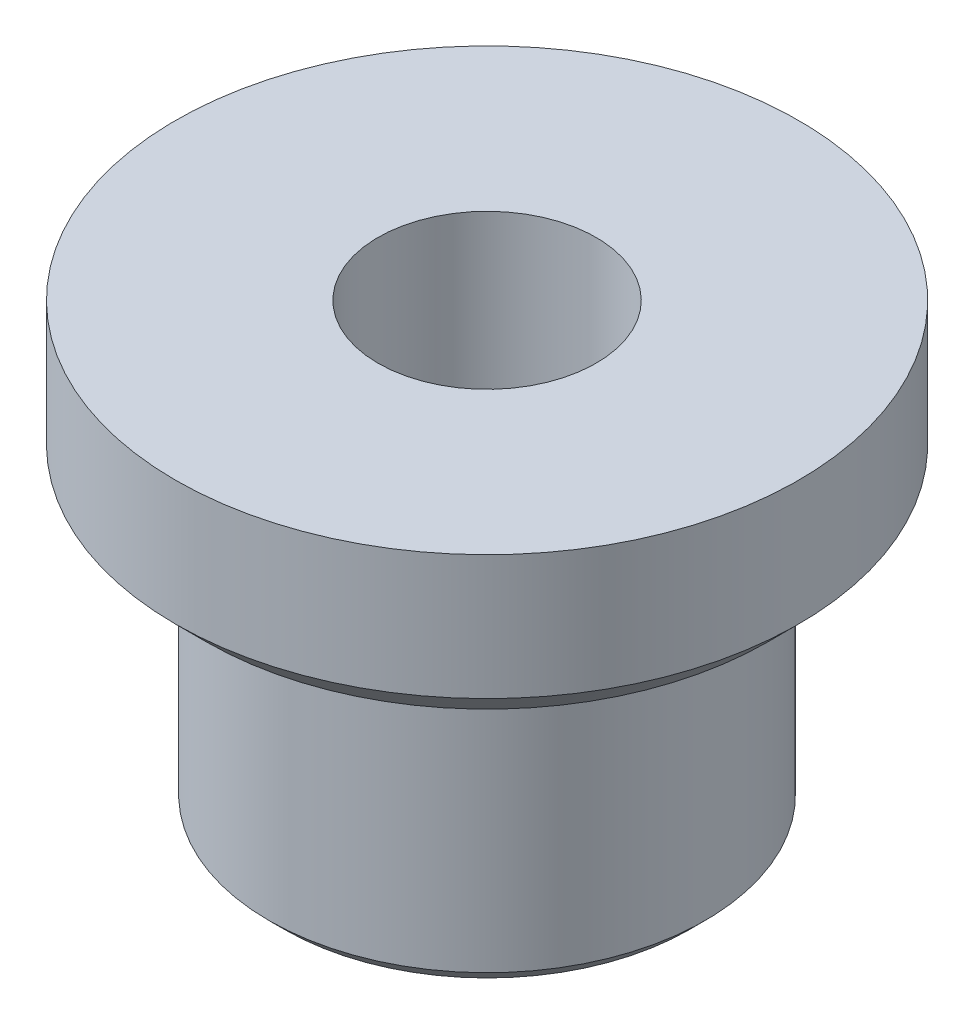
ISO-10303-21;
HEADER;
FILE_DESCRIPTION(('STEP AP214'),'2;1');
FILE_NAME('part.step','',(''),(''),'','','');
FILE_SCHEMA(('AUTOMOTIVE_DESIGN { 1 0 10303 214 1 1 1 1 }'));
ENDSEC;
DATA;
#1=APPLICATION_CONTEXT('core data for automotive mechanical design processes');
#2=APPLICATION_PROTOCOL_DEFINITION('international standard','automotive_design',2000,#1);
#3=PRODUCT_CONTEXT('',#1,'mechanical');
#4=PRODUCT('Part','Part','',(#3));
#5=PRODUCT_RELATED_PRODUCT_CATEGORY('part','',(#4));
#6=PRODUCT_DEFINITION_FORMATION('','',#4);
#7=PRODUCT_DEFINITION_CONTEXT('part definition',#1,'design');
#8=PRODUCT_DEFINITION('design','',#6,#7);
#9=PRODUCT_DEFINITION_SHAPE('','',#8);
#10=(LENGTH_UNIT() NAMED_UNIT(*) SI_UNIT(.MILLI.,.METRE.));
#11=(NAMED_UNIT(*) PLANE_ANGLE_UNIT() SI_UNIT($,.RADIAN.));
#12=(NAMED_UNIT(*) SI_UNIT($,.STERADIAN.) SOLID_ANGLE_UNIT());
#13=UNCERTAINTY_MEASURE_WITH_UNIT(LENGTH_MEASURE(1.E-05),#10,'distance_accuracy_value','');
#14=(GEOMETRIC_REPRESENTATION_CONTEXT(3) GLOBAL_UNCERTAINTY_ASSIGNED_CONTEXT((#13)) GLOBAL_UNIT_ASSIGNED_CONTEXT((#10,
#11,#12)) REPRESENTATION_CONTEXT('',''));
#15=CARTESIAN_POINT('',(0.,0.,0.));
#16=DIRECTION('',(0.,0.,1.));
#17=DIRECTION('',(1.,0.,0.));
#18=AXIS2_PLACEMENT_3D('',#15,#16,#17);
#19=CARTESIAN_POINT('',(0.,-5.,0.));
#20=DIRECTION('',(0.,1.,0.));
#21=DIRECTION('',(0.,0.,1.));
#22=AXIS2_PLACEMENT_3D('',#19,#20,#21);
#23=CYLINDRICAL_SURFACE('',#22,10.);
#24=CARTESIAN_POINT('',(0.,-4.00000000000001,0.));
#25=DIRECTION('',(0.,1.,0.));
#26=DIRECTION('',(0.,0.,1.));
#27=AXIS2_PLACEMENT_3D('',#24,#25,#26);
#28=CIRCLE('',#27,10.);
#29=CARTESIAN_POINT('',(0.,-4.00000000000001,10.));
#30=VERTEX_POINT('',#29);
#31=EDGE_CURVE('E51',#30,#30,#28,.T.);
#32=ORIENTED_EDGE('',*,*,#31,.T.);
#33=EDGE_LOOP('',(#32));
#34=FACE_BOUND('',#33,.T.);
#35=CARTESIAN_POINT('',(0.,0.,0.));
#36=DIRECTION('',(0.,1.,0.));
#37=DIRECTION('',(0.,0.,1.));
#38=AXIS2_PLACEMENT_3D('',#35,#36,#37);
#39=CIRCLE('',#38,10.);
#40=CARTESIAN_POINT('',(0.,0.,10.));
#41=VERTEX_POINT('',#40);
#42=EDGE_CURVE('E70',#41,#41,#39,.T.);
#43=ORIENTED_EDGE('',*,*,#42,.F.);
#44=EDGE_LOOP('',(#43));
#45=FACE_BOUND('',#44,.T.);
#46=ADVANCED_FACE('F43',(#34,#45),#23,.T.);
#47=CARTESIAN_POINT('',(0.,-5.,0.));
#48=DIRECTION('',(0.,1.,0.));
#49=DIRECTION('',(0.,0.,1.));
#50=AXIS2_PLACEMENT_3D('',#47,#48,#49);
#51=PLANE('',#50);
#52=CARTESIAN_POINT('',(0.,-5.,0.));
#53=DIRECTION('',(0.,1.,0.));
#54=DIRECTION('',(0.,0.,1.));
#55=AXIS2_PLACEMENT_3D('',#52,#53,#54);
#56=CIRCLE('',#55,9.);
#57=CARTESIAN_POINT('',(0.,-5.,9.));
#58=VERTEX_POINT('',#57);
#59=EDGE_CURVE('E11',#58,#58,#56,.F.);
#60=ORIENTED_EDGE('',*,*,#59,.T.);
#61=EDGE_LOOP('',(#60));
#62=FACE_BOUND('',#61,.T.);
#63=CARTESIAN_POINT('',(0.,-5.,0.));
#64=DIRECTION('',(0.,1.,0.));
#65=DIRECTION('',(0.,0.,1.));
#66=AXIS2_PLACEMENT_3D('',#63,#64,#65);
#67=CIRCLE('',#66,7.);
#68=CARTESIAN_POINT('',(0.,-5.,7.));
#69=VERTEX_POINT('',#68);
#70=EDGE_CURVE('E82',#69,#69,#67,.T.);
#71=ORIENTED_EDGE('',*,*,#70,.T.);
#72=EDGE_LOOP('',(#71));
#73=FACE_BOUND('',#72,.T.);
#74=ADVANCED_FACE('F92',(#62,#73),#51,.F.);
#75=CARTESIAN_POINT('',(0.,0.,0.));
#76=DIRECTION('',(0.,1.,0.));
#77=DIRECTION('',(0.,0.,1.));
#78=AXIS2_PLACEMENT_3D('',#75,#76,#77);
#79=PLANE('',#78);
#80=CARTESIAN_POINT('',(0.,0.,0.));
#81=DIRECTION('',(0.,1.,0.));
#82=DIRECTION('',(0.,0.,1.));
#83=AXIS2_PLACEMENT_3D('',#80,#81,#82);
#84=CIRCLE('',#83,3.5);
#85=CARTESIAN_POINT('',(0.,0.,3.5));
#86=VERTEX_POINT('',#85);
#87=EDGE_CURVE('E71',#86,#86,#84,.T.);
#88=ORIENTED_EDGE('',*,*,#87,.F.);
#89=EDGE_LOOP('',(#88));
#90=FACE_BOUND('',#89,.T.);
#91=ORIENTED_EDGE('',*,*,#42,.T.);
#92=EDGE_LOOP('',(#91));
#93=FACE_BOUND('',#92,.T.);
#94=ADVANCED_FACE('F97',(#90,#93),#79,.T.);
#95=CARTESIAN_POINT('',(0.,-14.24,0.));
#96=DIRECTION('',(0.,1.,0.));
#97=DIRECTION('',(0.,0.,1.));
#98=AXIS2_PLACEMENT_3D('',#95,#96,#97);
#99=CYLINDRICAL_SURFACE('',#98,7.);
#100=CARTESIAN_POINT('',(0.,-13.74,0.));
#101=DIRECTION('',(0.,1.,0.));
#102=DIRECTION('',(0.,0.,1.));
#103=AXIS2_PLACEMENT_3D('',#100,#101,#102);
#104=CIRCLE('',#103,7.);
#105=CARTESIAN_POINT('',(0.,-13.74,7.));
#106=VERTEX_POINT('',#105);
#107=EDGE_CURVE('E55',#106,#106,#104,.T.);
#108=ORIENTED_EDGE('',*,*,#107,.T.);
#109=EDGE_LOOP('',(#108));
#110=FACE_BOUND('',#109,.T.);
#111=ORIENTED_EDGE('',*,*,#70,.F.);
#112=EDGE_LOOP('',(#111));
#113=FACE_BOUND('',#112,.T.);
#114=ADVANCED_FACE('F94',(#110,#113),#99,.T.);
#115=CARTESIAN_POINT('',(0.,-14.24,0.));
#116=DIRECTION('',(0.,1.,0.));
#117=DIRECTION('',(0.,0.,1.));
#118=AXIS2_PLACEMENT_3D('',#115,#116,#117);
#119=PLANE('',#118);
#120=CARTESIAN_POINT('',(0.,-14.24,0.));
#121=DIRECTION('',(0.,1.,0.));
#122=DIRECTION('',(0.,0.,1.));
#123=AXIS2_PLACEMENT_3D('',#120,#121,#122);
#124=CIRCLE('',#123,5.7);
#125=CARTESIAN_POINT('',(0.,-14.24,5.7));
#126=VERTEX_POINT('',#125);
#127=EDGE_CURVE('E64',#126,#126,#124,.T.);
#128=ORIENTED_EDGE('',*,*,#127,.T.);
#129=EDGE_LOOP('',(#128));
#130=FACE_BOUND('',#129,.T.);
#131=CARTESIAN_POINT('',(0.,-14.24,0.));
#132=DIRECTION('',(0.,1.,0.));
#133=DIRECTION('',(0.,0.,1.));
#134=AXIS2_PLACEMENT_3D('',#131,#132,#133);
#135=CIRCLE('',#134,6.5);
#136=CARTESIAN_POINT('',(0.,-14.24,6.5));
#137=VERTEX_POINT('',#136);
#138=EDGE_CURVE('E67',#137,#137,#135,.F.);
#139=ORIENTED_EDGE('',*,*,#138,.T.);
#140=EDGE_LOOP('',(#139));
#141=FACE_BOUND('',#140,.T.);
#142=ADVANCED_FACE('F96',(#130,#141),#119,.F.);
#143=CARTESIAN_POINT('',(0.,-5.,0.));
#144=DIRECTION('',(0.,1.,0.));
#145=DIRECTION('',(0.,0.,1.));
#146=AXIS2_PLACEMENT_3D('',#143,#144,#145);
#147=CYLINDRICAL_SURFACE('',#146,3.5);
#148=CARTESIAN_POINT('',(0.,-5.2,0.));
#149=DIRECTION('',(0.,1.,0.));
#150=DIRECTION('',(0.,0.,1.));
#151=AXIS2_PLACEMENT_3D('',#148,#149,#150);
#152=CIRCLE('',#151,3.5);
#153=CARTESIAN_POINT('',(0.,-5.2,3.5));
#154=VERTEX_POINT('',#153);
#155=EDGE_CURVE('E74',#154,#154,#152,.T.);
#156=ORIENTED_EDGE('',*,*,#155,.F.);
#157=EDGE_LOOP('',(#156));
#158=FACE_BOUND('',#157,.T.);
#159=ORIENTED_EDGE('',*,*,#87,.T.);
#160=EDGE_LOOP('',(#159));
#161=FACE_BOUND('',#160,.T.);
#162=ADVANCED_FACE('F104',(#158,#161),#147,.F.);
#163=CARTESIAN_POINT('',(0.,-5.2,0.));
#164=DIRECTION('',(0.,1.,0.));
#165=DIRECTION('',(0.,0.,1.));
#166=AXIS2_PLACEMENT_3D('',#163,#164,#165);
#167=PLANE('',#166);
#168=CARTESIAN_POINT('',(0.,-5.2,0.));
#169=DIRECTION('',(0.,1.,0.));
#170=DIRECTION('',(0.,0.,1.));
#171=AXIS2_PLACEMENT_3D('',#168,#169,#170);
#172=CIRCLE('',#171,1.85);
#173=CARTESIAN_POINT('',(0.,-5.2,1.85));
#174=VERTEX_POINT('',#173);
#175=EDGE_CURVE('E79',#174,#174,#172,.T.);
#176=ORIENTED_EDGE('',*,*,#175,.F.);
#177=EDGE_LOOP('',(#176));
#178=FACE_BOUND('',#177,.T.);
#179=ORIENTED_EDGE('',*,*,#155,.T.);
#180=EDGE_LOOP('',(#179));
#181=FACE_BOUND('',#180,.T.);
#182=ADVANCED_FACE('F123',(#178,#181),#167,.T.);
#183=CARTESIAN_POINT('',(0.,-9.99,0.));
#184=DIRECTION('',(0.,-1.,0.));
#185=DIRECTION('',(0.,0.,-1.));
#186=AXIS2_PLACEMENT_3D('',#183,#184,#185);
#187=CYLINDRICAL_SURFACE('',#186,5.2);
#188=CARTESIAN_POINT('',(0.,-13.74,0.));
#189=DIRECTION('',(0.,1.,0.));
#190=DIRECTION('',(0.,0.,1.));
#191=AXIS2_PLACEMENT_3D('',#188,#189,#190);
#192=CIRCLE('',#191,5.2);
#193=CARTESIAN_POINT('',(0.,-13.74,5.2));
#194=VERTEX_POINT('',#193);
#195=EDGE_CURVE('E59',#194,#194,#192,.F.);
#196=ORIENTED_EDGE('',*,*,#195,.T.);
#197=EDGE_LOOP('',(#196));
#198=FACE_BOUND('',#197,.T.);
#199=CARTESIAN_POINT('',(0.,-9.99,0.));
#200=DIRECTION('',(0.,1.,0.));
#201=DIRECTION('',(0.,0.,1.));
#202=AXIS2_PLACEMENT_3D('',#199,#200,#201);
#203=CIRCLE('',#202,5.2);
#204=CARTESIAN_POINT('',(0.,-9.99,5.2));
#205=VERTEX_POINT('',#204);
#206=EDGE_CURVE('E75',#205,#205,#203,.T.);
#207=ORIENTED_EDGE('',*,*,#206,.T.);
#208=EDGE_LOOP('',(#207));
#209=FACE_BOUND('',#208,.T.);
#210=ADVANCED_FACE('F119',(#198,#209),#187,.F.);
#211=CARTESIAN_POINT('',(0.,-9.99,0.));
#212=DIRECTION('',(0.,1.,0.));
#213=DIRECTION('',(0.,0.,1.));
#214=AXIS2_PLACEMENT_3D('',#211,#212,#213);
#215=PLANE('',#214);
#216=CARTESIAN_POINT('',(0.,-9.99,0.));
#217=DIRECTION('',(0.,1.,0.));
#218=DIRECTION('',(0.,0.,1.));
#219=AXIS2_PLACEMENT_3D('',#216,#217,#218);
#220=CIRCLE('',#219,1.85);
#221=CARTESIAN_POINT('',(0.,-9.99,1.85));
#222=VERTEX_POINT('',#221);
#223=EDGE_CURVE('E76',#222,#222,#220,.T.);
#224=ORIENTED_EDGE('',*,*,#223,.T.);
#225=EDGE_LOOP('',(#224));
#226=FACE_BOUND('',#225,.T.);
#227=ORIENTED_EDGE('',*,*,#206,.F.);
#228=EDGE_LOOP('',(#227));
#229=FACE_BOUND('',#228,.T.);
#230=ADVANCED_FACE('F122',(#226,#229),#215,.F.);
#231=CARTESIAN_POINT('',(0.,-14.24,0.));
#232=DIRECTION('',(0.,1.,0.));
#233=DIRECTION('',(0.,0.,1.));
#234=AXIS2_PLACEMENT_3D('',#231,#232,#233);
#235=CYLINDRICAL_SURFACE('',#234,1.85);
#236=ORIENTED_EDGE('',*,*,#175,.T.);
#237=EDGE_LOOP('',(#236));
#238=FACE_BOUND('',#237,.T.);
#239=ORIENTED_EDGE('',*,*,#223,.F.);
#240=EDGE_LOOP('',(#239));
#241=FACE_BOUND('',#240,.T.);
#242=ADVANCED_FACE('F125',(#238,#241),#235,.F.);
#243=CARTESIAN_POINT('',(0.,-14.24,0.));
#244=DIRECTION('',(0.,-1.,0.));
#245=DIRECTION('',(0.,0.,-1.));
#246=AXIS2_PLACEMENT_3D('',#243,#244,#245);
#247=CONICAL_SURFACE('',#246,5.7,0.78539816339745);
#248=ORIENTED_EDGE('',*,*,#195,.F.);
#249=EDGE_LOOP('',(#248));
#250=FACE_BOUND('',#249,.T.);
#251=ORIENTED_EDGE('',*,*,#127,.F.);
#252=EDGE_LOOP('',(#251));
#253=FACE_BOUND('',#252,.T.);
#254=ADVANCED_FACE('F127',(#250,#253),#247,.F.);
#255=CARTESIAN_POINT('',(0.,-13.74,0.));
#256=DIRECTION('',(0.,1.,0.));
#257=DIRECTION('',(0.,0.,1.));
#258=AXIS2_PLACEMENT_3D('',#255,#256,#257);
#259=CONICAL_SURFACE('',#258,7.,0.785398163397453);
#260=ORIENTED_EDGE('',*,*,#138,.F.);
#261=EDGE_LOOP('',(#260));
#262=FACE_BOUND('',#261,.T.);
#263=ORIENTED_EDGE('',*,*,#107,.F.);
#264=EDGE_LOOP('',(#263));
#265=FACE_BOUND('',#264,.T.);
#266=ADVANCED_FACE('F140',(#262,#265),#259,.T.);
#267=CARTESIAN_POINT('',(0.,-4.00000000000001,0.));
#268=DIRECTION('',(0.,1.,0.));
#269=DIRECTION('',(0.,0.,1.));
#270=AXIS2_PLACEMENT_3D('',#267,#268,#269);
#271=CONICAL_SURFACE('',#270,10.,0.785398163397451);
#272=ORIENTED_EDGE('',*,*,#59,.F.);
#273=EDGE_LOOP('',(#272));
#274=FACE_BOUND('',#273,.T.);
#275=ORIENTED_EDGE('',*,*,#31,.F.);
#276=EDGE_LOOP('',(#275));
#277=FACE_BOUND('',#276,.T.);
#278=ADVANCED_FACE('F46',(#274,#277),#271,.T.);
#279=CLOSED_SHELL('',(#46,#74,#94,#114,#142,#162,#182,#210,#230,#242,#254,#266,#278));
#280=MANIFOLD_SOLID_BREP('B2',#279);
#281=ADVANCED_BREP_SHAPE_REPRESENTATION('',(#18,#280),#14);
#282=SHAPE_DEFINITION_REPRESENTATION(#9,#281);
ENDSEC;
END-ISO-10303-21;
